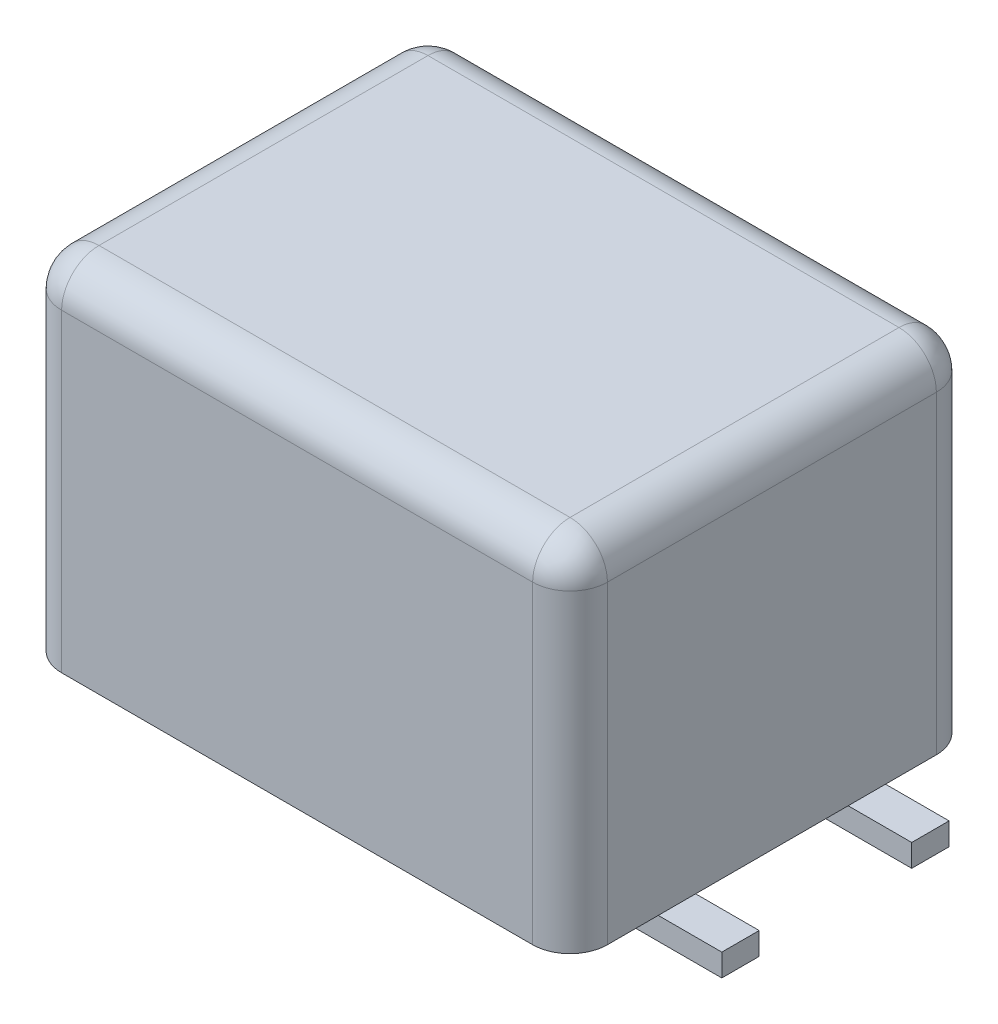
ISO-10303-21;
HEADER;
FILE_DESCRIPTION(('STEP AP214'),'2;1');
FILE_NAME('part.step','',(''),(''),'','','');
FILE_SCHEMA(('AUTOMOTIVE_DESIGN { 1 0 10303 214 1 1 1 1 }'));
ENDSEC;
DATA;
#1=APPLICATION_CONTEXT('core data for automotive mechanical design processes');
#2=APPLICATION_PROTOCOL_DEFINITION('international standard','automotive_design',2000,#1);
#3=PRODUCT_CONTEXT('',#1,'mechanical');
#4=PRODUCT('Part','Part','',(#3));
#5=PRODUCT_RELATED_PRODUCT_CATEGORY('part','',(#4));
#6=PRODUCT_DEFINITION_FORMATION('','',#4);
#7=PRODUCT_DEFINITION_CONTEXT('part definition',#1,'design');
#8=PRODUCT_DEFINITION('design','',#6,#7);
#9=PRODUCT_DEFINITION_SHAPE('','',#8);
#10=(LENGTH_UNIT() NAMED_UNIT(*) SI_UNIT(.MILLI.,.METRE.));
#11=(NAMED_UNIT(*) PLANE_ANGLE_UNIT() SI_UNIT($,.RADIAN.));
#12=(NAMED_UNIT(*) SI_UNIT($,.STERADIAN.) SOLID_ANGLE_UNIT());
#13=UNCERTAINTY_MEASURE_WITH_UNIT(LENGTH_MEASURE(1.E-05),#10,'distance_accuracy_value','');
#14=(GEOMETRIC_REPRESENTATION_CONTEXT(3) GLOBAL_UNCERTAINTY_ASSIGNED_CONTEXT((#13)) GLOBAL_UNIT_ASSIGNED_CONTEXT((#10,
#11,#12)) REPRESENTATION_CONTEXT('',''));
#15=CARTESIAN_POINT('',(0.,0.,0.));
#16=DIRECTION('',(0.,0.,1.));
#17=DIRECTION('',(1.,0.,0.));
#18=AXIS2_PLACEMENT_3D('',#15,#16,#17);
#19=CARTESIAN_POINT('',(3.15,0.3,2.2));
#20=DIRECTION('',(0.,1.,0.));
#21=DIRECTION('',(0.,0.,1.));
#22=AXIS2_PLACEMENT_3D('',#19,#20,#21);
#23=PLANE('',#22);
#24=DIRECTION('',(-1.,0.,0.));
#25=VECTOR('',#24,1.);
#26=CARTESIAN_POINT('',(-2.75,0.3,1.02));
#27=LINE('',#26,#25);
#28=CARTESIAN_POINT('',(-2.75,0.3,1.02));
#29=VERTEX_POINT('',#28);
#30=CARTESIAN_POINT('',(-3.65,0.3,1.02));
#31=VERTEX_POINT('',#30);
#32=EDGE_CURVE('E257',#29,#31,#27,.T.);
#33=ORIENTED_EDGE('',*,*,#32,.T.);
#34=DIRECTION('',(0.,0.,1.));
#35=VECTOR('',#34,1.);
#36=CARTESIAN_POINT('',(-3.65,0.3,-2.2));
#37=LINE('',#36,#35);
#38=CARTESIAN_POINT('',(-3.65,0.3,-1.02));
#39=VERTEX_POINT('',#38);
#40=EDGE_CURVE('E911',#39,#31,#37,.T.);
#41=ORIENTED_EDGE('',*,*,#40,.F.);
#42=DIRECTION('',(1.,0.,0.));
#43=VECTOR('',#42,1.);
#44=CARTESIAN_POINT('',(-2.75,0.3,-1.02));
#45=LINE('',#44,#43);
#46=CARTESIAN_POINT('',(-2.75,0.3,-1.02));
#47=VERTEX_POINT('',#46);
#48=EDGE_CURVE('E279',#39,#47,#45,.T.);
#49=ORIENTED_EDGE('',*,*,#48,.T.);
#50=DIRECTION('',(0.,0.,-1.));
#51=VECTOR('',#50,1.);
#52=CARTESIAN_POINT('',(-2.75,0.3,-1.52));
#53=LINE('',#52,#51);
#54=CARTESIAN_POINT('',(-2.75,0.3,-1.52));
#55=VERTEX_POINT('',#54);
#56=EDGE_CURVE('E299',#47,#55,#53,.T.);
#57=ORIENTED_EDGE('',*,*,#56,.T.);
#58=DIRECTION('',(-1.,0.,0.));
#59=VECTOR('',#58,1.);
#60=CARTESIAN_POINT('',(-2.75,0.3,-1.52));
#61=LINE('',#60,#59);
#62=CARTESIAN_POINT('',(-3.65,0.3,-1.52));
#63=VERTEX_POINT('',#62);
#64=EDGE_CURVE('E295',#55,#63,#61,.T.);
#65=ORIENTED_EDGE('',*,*,#64,.T.);
#66=CARTESIAN_POINT('',(-3.65,0.3,-2.2));
#67=VERTEX_POINT('',#66);
#68=EDGE_CURVE('E389',#67,#63,#37,.T.);
#69=ORIENTED_EDGE('',*,*,#68,.F.);
#70=CARTESIAN_POINT('',(-3.15,0.3,-2.2));
#71=DIRECTION('',(0.,1.,0.));
#72=DIRECTION('',(0.,0.,1.));
#73=AXIS2_PLACEMENT_3D('',#70,#71,#72);
#74=CIRCLE('',#73,0.5);
#75=CARTESIAN_POINT('',(-3.15,0.3,-2.7));
#76=VERTEX_POINT('',#75);
#77=EDGE_CURVE('E385',#76,#67,#74,.T.);
#78=ORIENTED_EDGE('',*,*,#77,.F.);
#79=DIRECTION('',(-1.,0.,0.));
#80=VECTOR('',#79,1.);
#81=CARTESIAN_POINT('',(-3.15,0.3,-2.7));
#82=LINE('',#81,#80);
#83=CARTESIAN_POINT('',(3.15,0.3,-2.7));
#84=VERTEX_POINT('',#83);
#85=EDGE_CURVE('E382',#84,#76,#82,.T.);
#86=ORIENTED_EDGE('',*,*,#85,.F.);
#87=CARTESIAN_POINT('',(3.15,0.3,-2.2));
#88=DIRECTION('',(0.,1.,0.));
#89=DIRECTION('',(0.,0.,-1.));
#90=AXIS2_PLACEMENT_3D('',#87,#88,#89);
#91=CIRCLE('',#90,0.5);
#92=CARTESIAN_POINT('',(3.65,0.3,-2.2));
#93=VERTEX_POINT('',#92);
#94=EDGE_CURVE('E378',#93,#84,#91,.T.);
#95=ORIENTED_EDGE('',*,*,#94,.F.);
#96=DIRECTION('',(0.,0.,-1.));
#97=VECTOR('',#96,1.);
#98=CARTESIAN_POINT('',(3.65,0.3,-2.2));
#99=LINE('',#98,#97);
#100=CARTESIAN_POINT('',(3.65,0.3,-1.52));
#101=VERTEX_POINT('',#100);
#102=EDGE_CURVE('E374',#101,#93,#99,.T.);
#103=ORIENTED_EDGE('',*,*,#102,.F.);
#104=DIRECTION('',(1.,0.,0.));
#105=VECTOR('',#104,1.);
#106=CARTESIAN_POINT('',(3.15,0.3,-1.52));
#107=LINE('',#106,#105);
#108=CARTESIAN_POINT('',(2.75,0.3,-1.52));
#109=VERTEX_POINT('',#108);
#110=EDGE_CURVE('E415',#109,#101,#107,.T.);
#111=ORIENTED_EDGE('',*,*,#110,.F.);
#112=DIRECTION('',(0.,0.,1.));
#113=VECTOR('',#112,1.);
#114=CARTESIAN_POINT('',(2.75,0.3,-1.52));
#115=LINE('',#114,#113);
#116=CARTESIAN_POINT('',(2.75,0.3,-1.02));
#117=VERTEX_POINT('',#116);
#118=EDGE_CURVE('E323',#109,#117,#115,.T.);
#119=ORIENTED_EDGE('',*,*,#118,.T.);
#120=DIRECTION('',(1.,0.,0.));
#121=VECTOR('',#120,1.);
#122=CARTESIAN_POINT('',(2.75,0.3,-1.02));
#123=LINE('',#122,#121);
#124=CARTESIAN_POINT('',(3.65,0.3,-1.02));
#125=VERTEX_POINT('',#124);
#126=EDGE_CURVE('E332',#117,#125,#123,.T.);
#127=ORIENTED_EDGE('',*,*,#126,.T.);
#128=CARTESIAN_POINT('',(3.65,0.3,1.02));
#129=VERTEX_POINT('',#128);
#130=EDGE_CURVE('E920',#129,#125,#99,.T.);
#131=ORIENTED_EDGE('',*,*,#130,.F.);
#132=DIRECTION('',(-1.,0.,0.));
#133=VECTOR('',#132,1.);
#134=CARTESIAN_POINT('',(2.75,0.3,1.02));
#135=LINE('',#134,#133);
#136=CARTESIAN_POINT('',(2.75,0.3,1.02));
#137=VERTEX_POINT('',#136);
#138=EDGE_CURVE('E362',#129,#137,#135,.T.);
#139=ORIENTED_EDGE('',*,*,#138,.T.);
#140=DIRECTION('',(0.,0.,1.));
#141=VECTOR('',#140,1.);
#142=CARTESIAN_POINT('',(2.75,0.3,1.02));
#143=LINE('',#142,#141);
#144=CARTESIAN_POINT('',(2.75,0.3,1.52));
#145=VERTEX_POINT('',#144);
#146=EDGE_CURVE('E354',#137,#145,#143,.T.);
#147=ORIENTED_EDGE('',*,*,#146,.T.);
#148=DIRECTION('',(1.,0.,0.));
#149=VECTOR('',#148,1.);
#150=CARTESIAN_POINT('',(2.75,0.3,1.52));
#151=LINE('',#150,#149);
#152=CARTESIAN_POINT('',(3.65,0.3,1.52));
#153=VERTEX_POINT('',#152);
#154=EDGE_CURVE('E365',#145,#153,#151,.T.);
#155=ORIENTED_EDGE('',*,*,#154,.T.);
#156=CARTESIAN_POINT('',(3.65,0.3,2.2));
#157=VERTEX_POINT('',#156);
#158=EDGE_CURVE('E375',#157,#153,#99,.T.);
#159=ORIENTED_EDGE('',*,*,#158,.F.);
#160=CARTESIAN_POINT('',(3.15,0.3,2.2));
#161=DIRECTION('',(0.,1.,0.));
#162=DIRECTION('',(0.,0.,1.));
#163=AXIS2_PLACEMENT_3D('',#160,#161,#162);
#164=CIRCLE('',#163,0.5);
#165=CARTESIAN_POINT('',(3.15,0.3,2.7));
#166=VERTEX_POINT('',#165);
#167=EDGE_CURVE('E357',#166,#157,#164,.T.);
#168=ORIENTED_EDGE('',*,*,#167,.F.);
#169=DIRECTION('',(1.,0.,0.));
#170=VECTOR('',#169,1.);
#171=CARTESIAN_POINT('',(-3.14999999999999,0.3,2.7));
#172=LINE('',#171,#170);
#173=CARTESIAN_POINT('',(-3.14999999999999,0.3,2.7));
#174=VERTEX_POINT('',#173);
#175=EDGE_CURVE('E396',#174,#166,#172,.T.);
#176=ORIENTED_EDGE('',*,*,#175,.F.);
#177=CARTESIAN_POINT('',(-3.15,0.3,2.2));
#178=DIRECTION('',(0.,1.,0.));
#179=DIRECTION('',(0.,0.,1.));
#180=AXIS2_PLACEMENT_3D('',#177,#178,#179);
#181=CIRCLE('',#180,0.5);
#182=CARTESIAN_POINT('',(-3.65,0.3,2.2));
#183=VERTEX_POINT('',#182);
#184=EDGE_CURVE('E392',#183,#174,#181,.T.);
#185=ORIENTED_EDGE('',*,*,#184,.F.);
#186=CARTESIAN_POINT('',(-3.65,0.3,1.52));
#187=VERTEX_POINT('',#186);
#188=EDGE_CURVE('E388',#187,#183,#37,.T.);
#189=ORIENTED_EDGE('',*,*,#188,.F.);
#190=DIRECTION('',(1.,0.,0.));
#191=VECTOR('',#190,1.);
#192=CARTESIAN_POINT('',(-2.75,0.3,1.52));
#193=LINE('',#192,#191);
#194=CARTESIAN_POINT('',(-2.75,0.3,1.52));
#195=VERTEX_POINT('',#194);
#196=EDGE_CURVE('E248',#187,#195,#193,.T.);
#197=ORIENTED_EDGE('',*,*,#196,.T.);
#198=DIRECTION('',(0.,0.,-1.));
#199=VECTOR('',#198,1.);
#200=CARTESIAN_POINT('',(-2.75,0.3,1.02));
#201=LINE('',#200,#199);
#202=EDGE_CURVE('E251',#195,#29,#201,.T.);
#203=ORIENTED_EDGE('',*,*,#202,.T.);
#204=EDGE_LOOP('',(#33,#41,#49,#57,#65,#69,#78,#86,#95,#103,#111,#119,#127,#131,#139,#147,#155,
#159,#168,#176,#185,#189,#197,#203));
#205=FACE_BOUND('',#204,.T.);
#206=ADVANCED_FACE('F33',(#205),#23,.F.);
#207=CARTESIAN_POINT('',(3.15,5.,2.2));
#208=DIRECTION('',(0.,-1.,0.));
#209=DIRECTION('',(0.,0.,-1.));
#210=AXIS2_PLACEMENT_3D('',#207,#208,#209);
#211=CYLINDRICAL_SURFACE('',#210,0.5);
#212=DIRECTION('',(0.,-1.,0.));
#213=VECTOR('',#212,1.);
#214=CARTESIAN_POINT('',(3.65,5.,2.2));
#215=LINE('',#214,#213);
#216=CARTESIAN_POINT('',(3.65,4.5,2.2));
#217=VERTEX_POINT('',#216);
#218=EDGE_CURVE('E413',#217,#157,#215,.T.);
#219=ORIENTED_EDGE('',*,*,#218,.F.);
#220=CARTESIAN_POINT('',(3.15,4.5,2.2));
#221=DIRECTION('',(0.,-1.,0.));
#222=DIRECTION('',(0.,0.,-1.));
#223=AXIS2_PLACEMENT_3D('',#220,#221,#222);
#224=CIRCLE('',#223,0.5);
#225=CARTESIAN_POINT('',(3.15,4.5,2.7));
#226=VERTEX_POINT('',#225);
#227=EDGE_CURVE('E42',#217,#226,#224,.T.);
#228=ORIENTED_EDGE('',*,*,#227,.T.);
#229=DIRECTION('',(0.,-1.,0.));
#230=VECTOR('',#229,1.);
#231=CARTESIAN_POINT('',(3.15,5.,2.7));
#232=LINE('',#231,#230);
#233=EDGE_CURVE('E399',#226,#166,#232,.T.);
#234=ORIENTED_EDGE('',*,*,#233,.T.);
#235=ORIENTED_EDGE('',*,*,#167,.T.);
#236=EDGE_LOOP('',(#219,#228,#234,#235));
#237=FACE_BOUND('',#236,.T.);
#238=ADVANCED_FACE('F529',(#237),#211,.T.);
#239=CARTESIAN_POINT('',(3.65,5.,-2.2));
#240=DIRECTION('',(-1.,0.,0.));
#241=DIRECTION('',(0.,0.,1.));
#242=AXIS2_PLACEMENT_3D('',#239,#240,#241);
#243=PLANE('',#242);
#244=DIRECTION('',(0.,-1.,0.));
#245=VECTOR('',#244,1.);
#246=CARTESIAN_POINT('',(3.65,5.,-2.2));
#247=LINE('',#246,#245);
#248=CARTESIAN_POINT('',(3.65,4.5,-2.2));
#249=VERTEX_POINT('',#248);
#250=EDGE_CURVE('E411',#249,#93,#247,.T.);
#251=ORIENTED_EDGE('',*,*,#250,.F.);
#252=DIRECTION('',(0.,0.,-1.));
#253=VECTOR('',#252,1.);
#254=CARTESIAN_POINT('',(3.65,4.5,2.2));
#255=LINE('',#254,#253);
#256=EDGE_CURVE('E57',#249,#217,#255,.F.);
#257=ORIENTED_EDGE('',*,*,#256,.T.);
#258=ORIENTED_EDGE('',*,*,#218,.T.);
#259=ORIENTED_EDGE('',*,*,#158,.T.);
#260=EDGE_CURVE('E379',#153,#129,#99,.T.);
#261=ORIENTED_EDGE('',*,*,#260,.T.);
#262=ORIENTED_EDGE('',*,*,#130,.T.);
#263=EDGE_CURVE('E478',#125,#101,#99,.T.);
#264=ORIENTED_EDGE('',*,*,#263,.T.);
#265=ORIENTED_EDGE('',*,*,#102,.T.);
#266=EDGE_LOOP('',(#251,#257,#258,#259,#261,#262,#264,#265));
#267=FACE_BOUND('',#266,.T.);
#268=ADVANCED_FACE('F473',(#267),#243,.F.);
#269=CARTESIAN_POINT('',(3.15,5.,-2.2));
#270=DIRECTION('',(0.,-1.,0.));
#271=DIRECTION('',(0.,0.,-1.));
#272=AXIS2_PLACEMENT_3D('',#269,#270,#271);
#273=CYLINDRICAL_SURFACE('',#272,0.5);
#274=DIRECTION('',(0.,-1.,0.));
#275=VECTOR('',#274,1.);
#276=CARTESIAN_POINT('',(3.15,5.,-2.7));
#277=LINE('',#276,#275);
#278=CARTESIAN_POINT('',(3.15,4.5,-2.7));
#279=VERTEX_POINT('',#278);
#280=EDGE_CURVE('E409',#279,#84,#277,.T.);
#281=ORIENTED_EDGE('',*,*,#280,.F.);
#282=CARTESIAN_POINT('',(3.15,4.5,-2.2));
#283=DIRECTION('',(0.,-1.,0.));
#284=DIRECTION('',(0.,0.,-1.));
#285=AXIS2_PLACEMENT_3D('',#282,#283,#284);
#286=CIRCLE('',#285,0.5);
#287=EDGE_CURVE('E436',#279,#249,#286,.T.);
#288=ORIENTED_EDGE('',*,*,#287,.T.);
#289=ORIENTED_EDGE('',*,*,#250,.T.);
#290=ORIENTED_EDGE('',*,*,#94,.T.);
#291=EDGE_LOOP('',(#281,#288,#289,#290));
#292=FACE_BOUND('',#291,.T.);
#293=ADVANCED_FACE('F471',(#292),#273,.T.);
#294=CARTESIAN_POINT('',(-3.15,5.,-2.7));
#295=DIRECTION('',(0.,0.,1.));
#296=DIRECTION('',(1.,0.,0.));
#297=AXIS2_PLACEMENT_3D('',#294,#295,#296);
#298=PLANE('',#297);
#299=DIRECTION('',(0.,-1.,0.));
#300=VECTOR('',#299,1.);
#301=CARTESIAN_POINT('',(-3.15,5.,-2.7));
#302=LINE('',#301,#300);
#303=CARTESIAN_POINT('',(-3.15,4.5,-2.7));
#304=VERTEX_POINT('',#303);
#305=EDGE_CURVE('E407',#304,#76,#302,.T.);
#306=ORIENTED_EDGE('',*,*,#305,.F.);
#307=DIRECTION('',(-1.,0.,0.));
#308=VECTOR('',#307,1.);
#309=CARTESIAN_POINT('',(3.15,4.5,-2.7));
#310=LINE('',#309,#308);
#311=EDGE_CURVE('E434',#304,#279,#310,.F.);
#312=ORIENTED_EDGE('',*,*,#311,.T.);
#313=ORIENTED_EDGE('',*,*,#280,.T.);
#314=ORIENTED_EDGE('',*,*,#85,.T.);
#315=EDGE_LOOP('',(#306,#312,#313,#314));
#316=FACE_BOUND('',#315,.T.);
#317=ADVANCED_FACE('F485',(#316),#298,.F.);
#318=CARTESIAN_POINT('',(-3.15,5.,-2.2));
#319=DIRECTION('',(0.,-1.,0.));
#320=DIRECTION('',(0.,0.,-1.));
#321=AXIS2_PLACEMENT_3D('',#318,#319,#320);
#322=CYLINDRICAL_SURFACE('',#321,0.5);
#323=DIRECTION('',(0.,-1.,0.));
#324=VECTOR('',#323,1.);
#325=CARTESIAN_POINT('',(-3.65,5.,-2.2));
#326=LINE('',#325,#324);
#327=CARTESIAN_POINT('',(-3.65,4.5,-2.2));
#328=VERTEX_POINT('',#327);
#329=EDGE_CURVE('E405',#328,#67,#326,.T.);
#330=ORIENTED_EDGE('',*,*,#329,.F.);
#331=CARTESIAN_POINT('',(-3.15,4.5,-2.2));
#332=DIRECTION('',(0.,-1.,0.));
#333=DIRECTION('',(0.,0.,-1.));
#334=AXIS2_PLACEMENT_3D('',#331,#332,#333);
#335=CIRCLE('',#334,0.5);
#336=EDGE_CURVE('E432',#328,#304,#335,.T.);
#337=ORIENTED_EDGE('',*,*,#336,.T.);
#338=ORIENTED_EDGE('',*,*,#305,.T.);
#339=ORIENTED_EDGE('',*,*,#77,.T.);
#340=EDGE_LOOP('',(#330,#337,#338,#339));
#341=FACE_BOUND('',#340,.T.);
#342=ADVANCED_FACE('F488',(#341),#322,.T.);
#343=CARTESIAN_POINT('',(-3.65,5.,-2.2));
#344=DIRECTION('',(1.,0.,0.));
#345=DIRECTION('',(0.,0.,-1.));
#346=AXIS2_PLACEMENT_3D('',#343,#344,#345);
#347=PLANE('',#346);
#348=DIRECTION('',(0.,-1.,0.));
#349=VECTOR('',#348,1.);
#350=CARTESIAN_POINT('',(-3.65,5.,2.2));
#351=LINE('',#350,#349);
#352=CARTESIAN_POINT('',(-3.65,4.5,2.2));
#353=VERTEX_POINT('',#352);
#354=EDGE_CURVE('E403',#353,#183,#351,.T.);
#355=ORIENTED_EDGE('',*,*,#354,.F.);
#356=DIRECTION('',(0.,0.,1.));
#357=VECTOR('',#356,1.);
#358=CARTESIAN_POINT('',(-3.65,4.5,-2.2));
#359=LINE('',#358,#357);
#360=EDGE_CURVE('E430',#353,#328,#359,.F.);
#361=ORIENTED_EDGE('',*,*,#360,.T.);
#362=ORIENTED_EDGE('',*,*,#329,.T.);
#363=ORIENTED_EDGE('',*,*,#68,.T.);
#364=EDGE_CURVE('E393',#63,#39,#37,.T.);
#365=ORIENTED_EDGE('',*,*,#364,.T.);
#366=ORIENTED_EDGE('',*,*,#40,.T.);
#367=EDGE_CURVE('E915',#31,#187,#37,.T.);
#368=ORIENTED_EDGE('',*,*,#367,.T.);
#369=ORIENTED_EDGE('',*,*,#188,.T.);
#370=EDGE_LOOP('',(#355,#361,#362,#363,#365,#366,#368,#369));
#371=FACE_BOUND('',#370,.T.);
#372=ADVANCED_FACE('F541',(#371),#347,.F.);
#373=CARTESIAN_POINT('',(-3.15,5.,2.2));
#374=DIRECTION('',(0.,-1.,0.));
#375=DIRECTION('',(0.,0.,-1.));
#376=AXIS2_PLACEMENT_3D('',#373,#374,#375);
#377=CYLINDRICAL_SURFACE('',#376,0.5);
#378=DIRECTION('',(0.,-1.,0.));
#379=VECTOR('',#378,1.);
#380=CARTESIAN_POINT('',(-3.14999999999999,5.,2.7));
#381=LINE('',#380,#379);
#382=CARTESIAN_POINT('',(-3.14999999999999,4.5,2.7));
#383=VERTEX_POINT('',#382);
#384=EDGE_CURVE('E401',#383,#174,#381,.T.);
#385=ORIENTED_EDGE('',*,*,#384,.F.);
#386=CARTESIAN_POINT('',(-3.15,4.5,2.2));
#387=DIRECTION('',(0.,-1.,0.));
#388=DIRECTION('',(0.,0.,-1.));
#389=AXIS2_PLACEMENT_3D('',#386,#387,#388);
#390=CIRCLE('',#389,0.5);
#391=EDGE_CURVE('E418',#383,#353,#390,.T.);
#392=ORIENTED_EDGE('',*,*,#391,.T.);
#393=ORIENTED_EDGE('',*,*,#354,.T.);
#394=ORIENTED_EDGE('',*,*,#184,.T.);
#395=EDGE_LOOP('',(#385,#392,#393,#394));
#396=FACE_BOUND('',#395,.T.);
#397=ADVANCED_FACE('F515',(#396),#377,.T.);
#398=CARTESIAN_POINT('',(-3.14999999999999,5.,2.7));
#399=DIRECTION('',(0.,0.,-1.));
#400=DIRECTION('',(-1.,0.,0.));
#401=AXIS2_PLACEMENT_3D('',#398,#399,#400);
#402=PLANE('',#401);
#403=ORIENTED_EDGE('',*,*,#233,.F.);
#404=DIRECTION('',(1.,0.,0.));
#405=VECTOR('',#404,1.);
#406=CARTESIAN_POINT('',(-3.14999999999999,4.5,2.7));
#407=LINE('',#406,#405);
#408=EDGE_CURVE('E11',#226,#383,#407,.F.);
#409=ORIENTED_EDGE('',*,*,#408,.T.);
#410=ORIENTED_EDGE('',*,*,#384,.T.);
#411=ORIENTED_EDGE('',*,*,#175,.T.);
#412=EDGE_LOOP('',(#403,#409,#410,#411));
#413=FACE_BOUND('',#412,.T.);
#414=ADVANCED_FACE('F512',(#413),#402,.F.);
#415=CARTESIAN_POINT('',(3.15,5.,2.2));
#416=DIRECTION('',(0.,1.,0.));
#417=DIRECTION('',(0.,0.,1.));
#418=AXIS2_PLACEMENT_3D('',#415,#416,#417);
#419=PLANE('',#418);
#420=DIRECTION('',(-1.,0.,0.));
#421=VECTOR('',#420,1.);
#422=CARTESIAN_POINT('',(-3.15,5.,-2.2));
#423=LINE('',#422,#421);
#424=CARTESIAN_POINT('',(3.15,5.,-2.2));
#425=VERTEX_POINT('',#424);
#426=CARTESIAN_POINT('',(-3.15,5.,-2.2));
#427=VERTEX_POINT('',#426);
#428=EDGE_CURVE('E425',#425,#427,#423,.T.);
#429=ORIENTED_EDGE('',*,*,#428,.T.);
#430=DIRECTION('',(0.,0.,1.));
#431=VECTOR('',#430,1.);
#432=CARTESIAN_POINT('',(-3.15,5.,2.2));
#433=LINE('',#432,#431);
#434=CARTESIAN_POINT('',(-3.15,5.,2.2));
#435=VERTEX_POINT('',#434);
#436=EDGE_CURVE('E427',#427,#435,#433,.T.);
#437=ORIENTED_EDGE('',*,*,#436,.T.);
#438=DIRECTION('',(1.,0.,0.));
#439=VECTOR('',#438,1.);
#440=CARTESIAN_POINT('',(3.15,5.,2.2));
#441=LINE('',#440,#439);
#442=CARTESIAN_POINT('',(3.15,5.,2.2));
#443=VERTEX_POINT('',#442);
#444=EDGE_CURVE('E421',#435,#443,#441,.T.);
#445=ORIENTED_EDGE('',*,*,#444,.T.);
#446=DIRECTION('',(0.,0.,-1.));
#447=VECTOR('',#446,1.);
#448=CARTESIAN_POINT('',(3.15,5.,-2.2));
#449=LINE('',#448,#447);
#450=EDGE_CURVE('E423',#443,#425,#449,.T.);
#451=ORIENTED_EDGE('',*,*,#450,.T.);
#452=EDGE_LOOP('',(#429,#437,#445,#451));
#453=FACE_BOUND('',#452,.T.);
#454=ADVANCED_FACE('F500',(#453),#419,.T.);
#455=CARTESIAN_POINT('',(3.15,0.3,2.2));
#456=DIRECTION('',(0.,1.,0.));
#457=DIRECTION('',(0.,0.,1.));
#458=AXIS2_PLACEMENT_3D('',#455,#456,#457);
#459=PLANE('',#458);
#460=ORIENTED_EDGE('',*,*,#260,.F.);
#461=CARTESIAN_POINT('',(4.5,0.3,1.52));
#462=VERTEX_POINT('',#461);
#463=EDGE_CURVE('E341',#153,#462,#151,.T.);
#464=ORIENTED_EDGE('',*,*,#463,.T.);
#465=DIRECTION('',(0.,0.,-1.));
#466=VECTOR('',#465,1.);
#467=CARTESIAN_POINT('',(4.5,0.3,1.02));
#468=LINE('',#467,#466);
#469=CARTESIAN_POINT('',(4.5,0.3,1.02));
#470=VERTEX_POINT('',#469);
#471=EDGE_CURVE('E361',#462,#470,#468,.T.);
#472=ORIENTED_EDGE('',*,*,#471,.T.);
#473=EDGE_CURVE('E358',#470,#129,#135,.T.);
#474=ORIENTED_EDGE('',*,*,#473,.T.);
#475=EDGE_LOOP('',(#460,#464,#472,#474));
#476=FACE_BOUND('',#475,.T.);
#477=ADVANCED_FACE('F586',(#476),#459,.T.);
#478=CARTESIAN_POINT('',(4.5,2.12002747232013,1.02));
#479=DIRECTION('',(-1.,0.,0.));
#480=DIRECTION('',(0.,0.,1.));
#481=AXIS2_PLACEMENT_3D('',#478,#479,#480);
#482=PLANE('',#481);
#483=ORIENTED_EDGE('',*,*,#471,.F.);
#484=DIRECTION('',(0.,-1.,0.));
#485=VECTOR('',#484,1.);
#486=CARTESIAN_POINT('',(4.5,2.12002747232013,1.52));
#487=LINE('',#486,#485);
#488=CARTESIAN_POINT('',(4.5,0.,1.52));
#489=VERTEX_POINT('',#488);
#490=EDGE_CURVE('E325',#462,#489,#487,.T.);
#491=ORIENTED_EDGE('',*,*,#490,.T.);
#492=DIRECTION('',(0.,0.,-1.));
#493=VECTOR('',#492,1.);
#494=CARTESIAN_POINT('',(4.5,0.,1.02));
#495=LINE('',#494,#493);
#496=CARTESIAN_POINT('',(4.5,0.,1.02));
#497=VERTEX_POINT('',#496);
#498=EDGE_CURVE('E351',#489,#497,#495,.T.);
#499=ORIENTED_EDGE('',*,*,#498,.T.);
#500=DIRECTION('',(0.,-1.,0.));
#501=VECTOR('',#500,1.);
#502=CARTESIAN_POINT('',(4.5,2.12002747232013,1.02));
#503=LINE('',#502,#501);
#504=EDGE_CURVE('E350',#470,#497,#503,.T.);
#505=ORIENTED_EDGE('',*,*,#504,.F.);
#506=EDGE_LOOP('',(#483,#491,#499,#505));
#507=FACE_BOUND('',#506,.T.);
#508=ADVANCED_FACE('F593',(#507),#482,.F.);
#509=CARTESIAN_POINT('',(2.75,2.12002747232013,1.02));
#510=DIRECTION('',(0.,0.,1.));
#511=DIRECTION('',(1.,0.,0.));
#512=AXIS2_PLACEMENT_3D('',#509,#510,#511);
#513=PLANE('',#512);
#514=ORIENTED_EDGE('',*,*,#473,.F.);
#515=ORIENTED_EDGE('',*,*,#504,.T.);
#516=DIRECTION('',(-1.,0.,0.));
#517=VECTOR('',#516,1.);
#518=CARTESIAN_POINT('',(2.75,0.,1.02));
#519=LINE('',#518,#517);
#520=CARTESIAN_POINT('',(2.75,0.,1.02));
#521=VERTEX_POINT('',#520);
#522=EDGE_CURVE('E347',#497,#521,#519,.T.);
#523=ORIENTED_EDGE('',*,*,#522,.T.);
#524=DIRECTION('',(0.,-1.,0.));
#525=VECTOR('',#524,1.);
#526=CARTESIAN_POINT('',(2.75,2.12002747232013,1.02));
#527=LINE('',#526,#525);
#528=EDGE_CURVE('E346',#137,#521,#527,.T.);
#529=ORIENTED_EDGE('',*,*,#528,.F.);
#530=ORIENTED_EDGE('',*,*,#138,.F.);
#531=EDGE_LOOP('',(#514,#515,#523,#529,#530));
#532=FACE_BOUND('',#531,.T.);
#533=ADVANCED_FACE('F600',(#532),#513,.F.);
#534=CARTESIAN_POINT('',(2.75,2.12002747232013,1.02));
#535=DIRECTION('',(1.,0.,0.));
#536=DIRECTION('',(0.,0.,-1.));
#537=AXIS2_PLACEMENT_3D('',#534,#535,#536);
#538=PLANE('',#537);
#539=ORIENTED_EDGE('',*,*,#146,.F.);
#540=ORIENTED_EDGE('',*,*,#528,.T.);
#541=DIRECTION('',(0.,0.,1.));
#542=VECTOR('',#541,1.);
#543=CARTESIAN_POINT('',(2.75,0.,1.02));
#544=LINE('',#543,#542);
#545=CARTESIAN_POINT('',(2.75,0.,1.52));
#546=VERTEX_POINT('',#545);
#547=EDGE_CURVE('E343',#521,#546,#544,.T.);
#548=ORIENTED_EDGE('',*,*,#547,.T.);
#549=DIRECTION('',(0.,-1.,0.));
#550=VECTOR('',#549,1.);
#551=CARTESIAN_POINT('',(2.75,2.12002747232013,1.52));
#552=LINE('',#551,#550);
#553=EDGE_CURVE('E342',#145,#546,#552,.T.);
#554=ORIENTED_EDGE('',*,*,#553,.F.);
#555=EDGE_LOOP('',(#539,#540,#548,#554));
#556=FACE_BOUND('',#555,.T.);
#557=ADVANCED_FACE('F608',(#556),#538,.F.);
#558=CARTESIAN_POINT('',(2.75,2.12002747232013,1.52));
#559=DIRECTION('',(0.,0.,-1.));
#560=DIRECTION('',(-1.,0.,0.));
#561=AXIS2_PLACEMENT_3D('',#558,#559,#560);
#562=PLANE('',#561);
#563=ORIENTED_EDGE('',*,*,#154,.F.);
#564=ORIENTED_EDGE('',*,*,#553,.T.);
#565=DIRECTION('',(1.,0.,0.));
#566=VECTOR('',#565,1.);
#567=CARTESIAN_POINT('',(2.75,0.,1.52));
#568=LINE('',#567,#566);
#569=EDGE_CURVE('E338',#546,#489,#568,.T.);
#570=ORIENTED_EDGE('',*,*,#569,.T.);
#571=ORIENTED_EDGE('',*,*,#490,.F.);
#572=ORIENTED_EDGE('',*,*,#463,.F.);
#573=EDGE_LOOP('',(#563,#564,#570,#571,#572));
#574=FACE_BOUND('',#573,.T.);
#575=ADVANCED_FACE('F616',(#574),#562,.F.);
#576=CARTESIAN_POINT('',(0.,0.,0.));
#577=DIRECTION('',(0.,1.,0.));
#578=DIRECTION('',(0.,0.,1.));
#579=AXIS2_PLACEMENT_3D('',#576,#577,#578);
#580=PLANE('',#579);
#581=ORIENTED_EDGE('',*,*,#498,.F.);
#582=ORIENTED_EDGE('',*,*,#569,.F.);
#583=ORIENTED_EDGE('',*,*,#547,.F.);
#584=ORIENTED_EDGE('',*,*,#522,.F.);
#585=EDGE_LOOP('',(#581,#582,#583,#584));
#586=FACE_BOUND('',#585,.T.);
#587=ADVANCED_FACE('F624',(#586),#580,.F.);
#588=CARTESIAN_POINT('',(3.15,0.3,2.2));
#589=DIRECTION('',(0.,1.,0.));
#590=DIRECTION('',(0.,0.,1.));
#591=AXIS2_PLACEMENT_3D('',#588,#589,#590);
#592=PLANE('',#591);
#593=ORIENTED_EDGE('',*,*,#263,.F.);
#594=CARTESIAN_POINT('',(4.5,0.3,-1.02));
#595=VERTEX_POINT('',#594);
#596=EDGE_CURVE('E310',#125,#595,#123,.T.);
#597=ORIENTED_EDGE('',*,*,#596,.T.);
#598=DIRECTION('',(0.,0.,-1.));
#599=VECTOR('',#598,1.);
#600=CARTESIAN_POINT('',(4.5,0.3,-1.52));
#601=LINE('',#600,#599);
#602=CARTESIAN_POINT('',(4.5,0.3,-1.52));
#603=VERTEX_POINT('',#602);
#604=EDGE_CURVE('E329',#595,#603,#601,.T.);
#605=ORIENTED_EDGE('',*,*,#604,.T.);
#606=DIRECTION('',(-1.,0.,0.));
#607=VECTOR('',#606,1.);
#608=CARTESIAN_POINT('',(2.75,0.3,-1.52));
#609=LINE('',#608,#607);
#610=EDGE_CURVE('E326',#603,#101,#609,.T.);
#611=ORIENTED_EDGE('',*,*,#610,.T.);
#612=EDGE_LOOP('',(#593,#597,#605,#611));
#613=FACE_BOUND('',#612,.T.);
#614=ADVANCED_FACE('F632',(#613),#592,.T.);
#615=CARTESIAN_POINT('',(4.5,2.12002747232013,-1.52));
#616=DIRECTION('',(-1.,0.,0.));
#617=DIRECTION('',(0.,0.,1.));
#618=AXIS2_PLACEMENT_3D('',#615,#616,#617);
#619=PLANE('',#618);
#620=ORIENTED_EDGE('',*,*,#604,.F.);
#621=DIRECTION('',(0.,-1.,0.));
#622=VECTOR('',#621,1.);
#623=CARTESIAN_POINT('',(4.5,2.12002747232013,-1.02));
#624=LINE('',#623,#622);
#625=CARTESIAN_POINT('',(4.5,0.,-1.02));
#626=VERTEX_POINT('',#625);
#627=EDGE_CURVE('E294',#595,#626,#624,.T.);
#628=ORIENTED_EDGE('',*,*,#627,.T.);
#629=DIRECTION('',(0.,0.,-1.));
#630=VECTOR('',#629,1.);
#631=CARTESIAN_POINT('',(4.5,0.,-1.52));
#632=LINE('',#631,#630);
#633=CARTESIAN_POINT('',(4.5,0.,-1.52));
#634=VERTEX_POINT('',#633);
#635=EDGE_CURVE('E320',#626,#634,#632,.T.);
#636=ORIENTED_EDGE('',*,*,#635,.T.);
#637=DIRECTION('',(0.,-1.,0.));
#638=VECTOR('',#637,1.);
#639=CARTESIAN_POINT('',(4.5,2.12002747232013,-1.52));
#640=LINE('',#639,#638);
#641=EDGE_CURVE('E319',#603,#634,#640,.T.);
#642=ORIENTED_EDGE('',*,*,#641,.F.);
#643=EDGE_LOOP('',(#620,#628,#636,#642));
#644=FACE_BOUND('',#643,.T.);
#645=ADVANCED_FACE('F640',(#644),#619,.F.);
#646=CARTESIAN_POINT('',(2.75,2.12002747232013,-1.52));
#647=DIRECTION('',(0.,0.,1.));
#648=DIRECTION('',(1.,0.,0.));
#649=AXIS2_PLACEMENT_3D('',#646,#647,#648);
#650=PLANE('',#649);
#651=ORIENTED_EDGE('',*,*,#610,.F.);
#652=ORIENTED_EDGE('',*,*,#641,.T.);
#653=DIRECTION('',(-1.,0.,0.));
#654=VECTOR('',#653,1.);
#655=CARTESIAN_POINT('',(2.75,0.,-1.52));
#656=LINE('',#655,#654);
#657=CARTESIAN_POINT('',(2.75,0.,-1.52));
#658=VERTEX_POINT('',#657);
#659=EDGE_CURVE('E316',#634,#658,#656,.T.);
#660=ORIENTED_EDGE('',*,*,#659,.T.);
#661=DIRECTION('',(0.,-1.,0.));
#662=VECTOR('',#661,1.);
#663=CARTESIAN_POINT('',(2.75,2.12002747232013,-1.52));
#664=LINE('',#663,#662);
#665=EDGE_CURVE('E315',#109,#658,#664,.T.);
#666=ORIENTED_EDGE('',*,*,#665,.F.);
#667=ORIENTED_EDGE('',*,*,#110,.T.);
#668=EDGE_LOOP('',(#651,#652,#660,#666,#667));
#669=FACE_BOUND('',#668,.T.);
#670=ADVANCED_FACE('F648',(#669),#650,.F.);
#671=CARTESIAN_POINT('',(2.75,2.12002747232013,-1.52));
#672=DIRECTION('',(1.,0.,0.));
#673=DIRECTION('',(0.,0.,-1.));
#674=AXIS2_PLACEMENT_3D('',#671,#672,#673);
#675=PLANE('',#674);
#676=ORIENTED_EDGE('',*,*,#118,.F.);
#677=ORIENTED_EDGE('',*,*,#665,.T.);
#678=DIRECTION('',(0.,0.,1.));
#679=VECTOR('',#678,1.);
#680=CARTESIAN_POINT('',(2.75,0.,-1.52));
#681=LINE('',#680,#679);
#682=CARTESIAN_POINT('',(2.75,0.,-1.02));
#683=VERTEX_POINT('',#682);
#684=EDGE_CURVE('E312',#658,#683,#681,.T.);
#685=ORIENTED_EDGE('',*,*,#684,.T.);
#686=DIRECTION('',(0.,-1.,0.));
#687=VECTOR('',#686,1.);
#688=CARTESIAN_POINT('',(2.75,2.12002747232013,-1.02));
#689=LINE('',#688,#687);
#690=EDGE_CURVE('E311',#117,#683,#689,.T.);
#691=ORIENTED_EDGE('',*,*,#690,.F.);
#692=EDGE_LOOP('',(#676,#677,#685,#691));
#693=FACE_BOUND('',#692,.T.);
#694=ADVANCED_FACE('F656',(#693),#675,.F.);
#695=CARTESIAN_POINT('',(2.75,2.12002747232013,-1.02));
#696=DIRECTION('',(0.,0.,-1.));
#697=DIRECTION('',(-1.,0.,0.));
#698=AXIS2_PLACEMENT_3D('',#695,#696,#697);
#699=PLANE('',#698);
#700=ORIENTED_EDGE('',*,*,#126,.F.);
#701=ORIENTED_EDGE('',*,*,#690,.T.);
#702=DIRECTION('',(1.,0.,0.));
#703=VECTOR('',#702,1.);
#704=CARTESIAN_POINT('',(2.75,0.,-1.02));
#705=LINE('',#704,#703);
#706=EDGE_CURVE('E307',#683,#626,#705,.T.);
#707=ORIENTED_EDGE('',*,*,#706,.T.);
#708=ORIENTED_EDGE('',*,*,#627,.F.);
#709=ORIENTED_EDGE('',*,*,#596,.F.);
#710=EDGE_LOOP('',(#700,#701,#707,#708,#709));
#711=FACE_BOUND('',#710,.T.);
#712=ADVANCED_FACE('F664',(#711),#699,.F.);
#713=CARTESIAN_POINT('',(0.,0.,0.));
#714=DIRECTION('',(0.,1.,0.));
#715=DIRECTION('',(0.,0.,1.));
#716=AXIS2_PLACEMENT_3D('',#713,#714,#715);
#717=PLANE('',#716);
#718=ORIENTED_EDGE('',*,*,#635,.F.);
#719=ORIENTED_EDGE('',*,*,#706,.F.);
#720=ORIENTED_EDGE('',*,*,#684,.F.);
#721=ORIENTED_EDGE('',*,*,#659,.F.);
#722=EDGE_LOOP('',(#718,#719,#720,#721));
#723=FACE_BOUND('',#722,.T.);
#724=ADVANCED_FACE('F672',(#723),#717,.F.);
#725=CARTESIAN_POINT('',(3.15,0.3,2.2));
#726=DIRECTION('',(0.,1.,0.));
#727=DIRECTION('',(0.,0.,1.));
#728=AXIS2_PLACEMENT_3D('',#725,#726,#727);
#729=PLANE('',#728);
#730=ORIENTED_EDGE('',*,*,#364,.F.);
#731=CARTESIAN_POINT('',(-4.5,0.3,-1.52));
#732=VERTEX_POINT('',#731);
#733=EDGE_CURVE('E298',#63,#732,#61,.T.);
#734=ORIENTED_EDGE('',*,*,#733,.T.);
#735=DIRECTION('',(0.,0.,1.));
#736=VECTOR('',#735,1.);
#737=CARTESIAN_POINT('',(-4.5,0.3,-1.52));
#738=LINE('',#737,#736);
#739=CARTESIAN_POINT('',(-4.5,0.3,-1.02));
#740=VERTEX_POINT('',#739);
#741=EDGE_CURVE('E291',#732,#740,#738,.T.);
#742=ORIENTED_EDGE('',*,*,#741,.T.);
#743=EDGE_CURVE('E302',#740,#39,#45,.T.);
#744=ORIENTED_EDGE('',*,*,#743,.T.);
#745=EDGE_LOOP('',(#730,#734,#742,#744));
#746=FACE_BOUND('',#745,.T.);
#747=ADVANCED_FACE('F680',(#746),#729,.T.);
#748=CARTESIAN_POINT('',(-2.75,2.12002747232013,-1.52));
#749=DIRECTION('',(-1.,0.,0.));
#750=DIRECTION('',(0.,0.,1.));
#751=AXIS2_PLACEMENT_3D('',#748,#749,#750);
#752=PLANE('',#751);
#753=ORIENTED_EDGE('',*,*,#56,.F.);
#754=DIRECTION('',(0.,-1.,0.));
#755=VECTOR('',#754,1.);
#756=CARTESIAN_POINT('',(-2.75,2.12002747232013,-1.02));
#757=LINE('',#756,#755);
#758=CARTESIAN_POINT('',(-2.75,0.,-1.02));
#759=VERTEX_POINT('',#758);
#760=EDGE_CURVE('E256',#47,#759,#757,.T.);
#761=ORIENTED_EDGE('',*,*,#760,.T.);
#762=DIRECTION('',(0.,0.,-1.));
#763=VECTOR('',#762,1.);
#764=CARTESIAN_POINT('',(-2.75,0.,-1.52));
#765=LINE('',#764,#763);
#766=CARTESIAN_POINT('',(-2.75,0.,-1.52));
#767=VERTEX_POINT('',#766);
#768=EDGE_CURVE('E259',#759,#767,#765,.T.);
#769=ORIENTED_EDGE('',*,*,#768,.T.);
#770=DIRECTION('',(0.,-1.,0.));
#771=VECTOR('',#770,1.);
#772=CARTESIAN_POINT('',(-2.75,2.12002747232013,-1.52));
#773=LINE('',#772,#771);
#774=EDGE_CURVE('E288',#55,#767,#773,.T.);
#775=ORIENTED_EDGE('',*,*,#774,.F.);
#776=EDGE_LOOP('',(#753,#761,#769,#775));
#777=FACE_BOUND('',#776,.T.);
#778=ADVANCED_FACE('F688',(#777),#752,.F.);
#779=CARTESIAN_POINT('',(-2.75,2.12002747232013,-1.52));
#780=DIRECTION('',(0.,0.,1.));
#781=DIRECTION('',(1.,0.,0.));
#782=AXIS2_PLACEMENT_3D('',#779,#780,#781);
#783=PLANE('',#782);
#784=ORIENTED_EDGE('',*,*,#64,.F.);
#785=ORIENTED_EDGE('',*,*,#774,.T.);
#786=DIRECTION('',(-1.,0.,0.));
#787=VECTOR('',#786,1.);
#788=CARTESIAN_POINT('',(-2.75,0.,-1.52));
#789=LINE('',#788,#787);
#790=CARTESIAN_POINT('',(-4.5,0.,-1.52));
#791=VERTEX_POINT('',#790);
#792=EDGE_CURVE('E285',#767,#791,#789,.T.);
#793=ORIENTED_EDGE('',*,*,#792,.T.);
#794=DIRECTION('',(0.,-1.,0.));
#795=VECTOR('',#794,1.);
#796=CARTESIAN_POINT('',(-4.5,2.12002747232013,-1.52));
#797=LINE('',#796,#795);
#798=EDGE_CURVE('E284',#732,#791,#797,.T.);
#799=ORIENTED_EDGE('',*,*,#798,.F.);
#800=ORIENTED_EDGE('',*,*,#733,.F.);
#801=EDGE_LOOP('',(#784,#785,#793,#799,#800));
#802=FACE_BOUND('',#801,.T.);
#803=ADVANCED_FACE('F696',(#802),#783,.F.);
#804=CARTESIAN_POINT('',(-4.5,2.12002747232013,-1.52));
#805=DIRECTION('',(1.,0.,0.));
#806=DIRECTION('',(0.,0.,-1.));
#807=AXIS2_PLACEMENT_3D('',#804,#805,#806);
#808=PLANE('',#807);
#809=ORIENTED_EDGE('',*,*,#741,.F.);
#810=ORIENTED_EDGE('',*,*,#798,.T.);
#811=DIRECTION('',(0.,0.,1.));
#812=VECTOR('',#811,1.);
#813=CARTESIAN_POINT('',(-4.5,0.,-1.52));
#814=LINE('',#813,#812);
#815=CARTESIAN_POINT('',(-4.5,0.,-1.02));
#816=VERTEX_POINT('',#815);
#817=EDGE_CURVE('E281',#791,#816,#814,.T.);
#818=ORIENTED_EDGE('',*,*,#817,.T.);
#819=DIRECTION('',(0.,-1.,0.));
#820=VECTOR('',#819,1.);
#821=CARTESIAN_POINT('',(-4.5,2.12002747232013,-1.02));
#822=LINE('',#821,#820);
#823=EDGE_CURVE('E280',#740,#816,#822,.T.);
#824=ORIENTED_EDGE('',*,*,#823,.F.);
#825=EDGE_LOOP('',(#809,#810,#818,#824));
#826=FACE_BOUND('',#825,.T.);
#827=ADVANCED_FACE('F704',(#826),#808,.F.);
#828=CARTESIAN_POINT('',(-2.75,2.12002747232013,-1.02));
#829=DIRECTION('',(0.,0.,-1.));
#830=DIRECTION('',(-1.,0.,0.));
#831=AXIS2_PLACEMENT_3D('',#828,#829,#830);
#832=PLANE('',#831);
#833=ORIENTED_EDGE('',*,*,#743,.F.);
#834=ORIENTED_EDGE('',*,*,#823,.T.);
#835=DIRECTION('',(1.,0.,0.));
#836=VECTOR('',#835,1.);
#837=CARTESIAN_POINT('',(-2.75,0.,-1.02));
#838=LINE('',#837,#836);
#839=EDGE_CURVE('E276',#816,#759,#838,.T.);
#840=ORIENTED_EDGE('',*,*,#839,.T.);
#841=ORIENTED_EDGE('',*,*,#760,.F.);
#842=ORIENTED_EDGE('',*,*,#48,.F.);
#843=EDGE_LOOP('',(#833,#834,#840,#841,#842));
#844=FACE_BOUND('',#843,.T.);
#845=ADVANCED_FACE('F712',(#844),#832,.F.);
#846=CARTESIAN_POINT('',(0.,0.,0.));
#847=DIRECTION('',(0.,-1.,0.));
#848=DIRECTION('',(0.,0.,-1.));
#849=AXIS2_PLACEMENT_3D('',#846,#847,#848);
#850=PLANE('',#849);
#851=ORIENTED_EDGE('',*,*,#768,.F.);
#852=ORIENTED_EDGE('',*,*,#839,.F.);
#853=ORIENTED_EDGE('',*,*,#817,.F.);
#854=ORIENTED_EDGE('',*,*,#792,.F.);
#855=EDGE_LOOP('',(#851,#852,#853,#854));
#856=FACE_BOUND('',#855,.T.);
#857=ADVANCED_FACE('F720',(#856),#850,.T.);
#858=CARTESIAN_POINT('',(3.15,0.3,2.2));
#859=DIRECTION('',(0.,1.,0.));
#860=DIRECTION('',(0.,0.,1.));
#861=AXIS2_PLACEMENT_3D('',#858,#859,#860);
#862=PLANE('',#861);
#863=ORIENTED_EDGE('',*,*,#367,.F.);
#864=CARTESIAN_POINT('',(-4.5,0.3,1.02));
#865=VERTEX_POINT('',#864);
#866=EDGE_CURVE('E255',#31,#865,#27,.T.);
#867=ORIENTED_EDGE('',*,*,#866,.T.);
#868=DIRECTION('',(0.,0.,1.));
#869=VECTOR('',#868,1.);
#870=CARTESIAN_POINT('',(-4.5,0.3,1.02));
#871=LINE('',#870,#869);
#872=CARTESIAN_POINT('',(-4.5,0.3,1.52));
#873=VERTEX_POINT('',#872);
#874=EDGE_CURVE('E235',#865,#873,#871,.T.);
#875=ORIENTED_EDGE('',*,*,#874,.T.);
#876=EDGE_CURVE('E245',#873,#187,#193,.T.);
#877=ORIENTED_EDGE('',*,*,#876,.T.);
#878=EDGE_LOOP('',(#863,#867,#875,#877));
#879=FACE_BOUND('',#878,.T.);
#880=ADVANCED_FACE('F253',(#879),#862,.T.);
#881=CARTESIAN_POINT('',(-2.75,2.12002747232013,1.02));
#882=DIRECTION('',(-1.,0.,0.));
#883=DIRECTION('',(0.,0.,1.));
#884=AXIS2_PLACEMENT_3D('',#881,#882,#883);
#885=PLANE('',#884);
#886=ORIENTED_EDGE('',*,*,#202,.F.);
#887=DIRECTION('',(0.,-1.,0.));
#888=VECTOR('',#887,1.);
#889=CARTESIAN_POINT('',(-2.75,2.12002747232013,1.52));
#890=LINE('',#889,#888);
#891=CARTESIAN_POINT('',(-2.75,0.,1.52));
#892=VERTEX_POINT('',#891);
#893=EDGE_CURVE('E274',#195,#892,#890,.T.);
#894=ORIENTED_EDGE('',*,*,#893,.T.);
#895=DIRECTION('',(0.,0.,-1.));
#896=VECTOR('',#895,1.);
#897=CARTESIAN_POINT('',(-2.75,0.,1.02));
#898=LINE('',#897,#896);
#899=CARTESIAN_POINT('',(-2.75,0.,1.02));
#900=VERTEX_POINT('',#899);
#901=EDGE_CURVE('E264',#892,#900,#898,.T.);
#902=ORIENTED_EDGE('',*,*,#901,.T.);
#903=DIRECTION('',(0.,-1.,0.));
#904=VECTOR('',#903,1.);
#905=CARTESIAN_POINT('',(-2.75,2.12002747232013,1.02));
#906=LINE('',#905,#904);
#907=EDGE_CURVE('E269',#29,#900,#906,.T.);
#908=ORIENTED_EDGE('',*,*,#907,.F.);
#909=EDGE_LOOP('',(#886,#894,#902,#908));
#910=FACE_BOUND('',#909,.T.);
#911=ADVANCED_FACE('F735',(#910),#885,.F.);
#912=CARTESIAN_POINT('',(-2.75,2.12002747232013,1.02));
#913=DIRECTION('',(0.,0.,1.));
#914=DIRECTION('',(1.,0.,0.));
#915=AXIS2_PLACEMENT_3D('',#912,#913,#914);
#916=PLANE('',#915);
#917=ORIENTED_EDGE('',*,*,#32,.F.);
#918=ORIENTED_EDGE('',*,*,#907,.T.);
#919=DIRECTION('',(-1.,0.,0.));
#920=VECTOR('',#919,1.);
#921=CARTESIAN_POINT('',(-2.75,0.,1.02));
#922=LINE('',#921,#920);
#923=CARTESIAN_POINT('',(-4.5,0.,1.02));
#924=VERTEX_POINT('',#923);
#925=EDGE_CURVE('E271',#900,#924,#922,.T.);
#926=ORIENTED_EDGE('',*,*,#925,.T.);
#927=DIRECTION('',(0.,-1.,0.));
#928=VECTOR('',#927,1.);
#929=CARTESIAN_POINT('',(-4.5,2.12002747232013,1.02));
#930=LINE('',#929,#928);
#931=EDGE_CURVE('E272',#865,#924,#930,.T.);
#932=ORIENTED_EDGE('',*,*,#931,.F.);
#933=ORIENTED_EDGE('',*,*,#866,.F.);
#934=EDGE_LOOP('',(#917,#918,#926,#932,#933));
#935=FACE_BOUND('',#934,.T.);
#936=ADVANCED_FACE('F742',(#935),#916,.F.);
#937=CARTESIAN_POINT('',(-4.5,2.12002747232013,1.02));
#938=DIRECTION('',(1.,0.,0.));
#939=DIRECTION('',(0.,0.,-1.));
#940=AXIS2_PLACEMENT_3D('',#937,#938,#939);
#941=PLANE('',#940);
#942=ORIENTED_EDGE('',*,*,#874,.F.);
#943=ORIENTED_EDGE('',*,*,#931,.T.);
#944=DIRECTION('',(0.,0.,1.));
#945=VECTOR('',#944,1.);
#946=CARTESIAN_POINT('',(-4.5,0.,1.02));
#947=LINE('',#946,#945);
#948=CARTESIAN_POINT('',(-4.5,0.,1.52));
#949=VERTEX_POINT('',#948);
#950=EDGE_CURVE('E238',#924,#949,#947,.T.);
#951=ORIENTED_EDGE('',*,*,#950,.T.);
#952=DIRECTION('',(0.,-1.,0.));
#953=VECTOR('',#952,1.);
#954=CARTESIAN_POINT('',(-4.5,2.12002747232013,1.52));
#955=LINE('',#954,#953);
#956=EDGE_CURVE('E231',#873,#949,#955,.T.);
#957=ORIENTED_EDGE('',*,*,#956,.F.);
#958=EDGE_LOOP('',(#942,#943,#951,#957));
#959=FACE_BOUND('',#958,.T.);
#960=ADVANCED_FACE('F233',(#959),#941,.F.);
#961=CARTESIAN_POINT('',(-2.75,2.12002747232013,1.52));
#962=DIRECTION('',(0.,0.,-1.));
#963=DIRECTION('',(-1.,0.,0.));
#964=AXIS2_PLACEMENT_3D('',#961,#962,#963);
#965=PLANE('',#964);
#966=ORIENTED_EDGE('',*,*,#876,.F.);
#967=ORIENTED_EDGE('',*,*,#956,.T.);
#968=DIRECTION('',(1.,0.,0.));
#969=VECTOR('',#968,1.);
#970=CARTESIAN_POINT('',(-2.75,0.,1.52));
#971=LINE('',#970,#969);
#972=EDGE_CURVE('E242',#949,#892,#971,.T.);
#973=ORIENTED_EDGE('',*,*,#972,.T.);
#974=ORIENTED_EDGE('',*,*,#893,.F.);
#975=ORIENTED_EDGE('',*,*,#196,.F.);
#976=EDGE_LOOP('',(#966,#967,#973,#974,#975));
#977=FACE_BOUND('',#976,.T.);
#978=ADVANCED_FACE('F246',(#977),#965,.F.);
#979=CARTESIAN_POINT('',(0.,0.,0.));
#980=DIRECTION('',(0.,-1.,0.));
#981=DIRECTION('',(0.,0.,-1.));
#982=AXIS2_PLACEMENT_3D('',#979,#980,#981);
#983=PLANE('',#982);
#984=ORIENTED_EDGE('',*,*,#901,.F.);
#985=ORIENTED_EDGE('',*,*,#972,.F.);
#986=ORIENTED_EDGE('',*,*,#950,.F.);
#987=ORIENTED_EDGE('',*,*,#925,.F.);
#988=EDGE_LOOP('',(#984,#985,#986,#987));
#989=FACE_BOUND('',#988,.T.);
#990=ADVANCED_FACE('F763',(#989),#983,.T.);
#991=CARTESIAN_POINT('',(3.15,4.5,-2.2));
#992=DIRECTION('',(0.,0.,1.));
#993=DIRECTION('',(1.,0.,0.));
#994=AXIS2_PLACEMENT_3D('',#991,#992,#993);
#995=SPHERICAL_SURFACE('',#994,0.5);
#996=CARTESIAN_POINT('',(3.15,4.5,-2.2));
#997=DIRECTION('',(0.,0.,1.));
#998=DIRECTION('',(1.,0.,0.));
#999=AXIS2_PLACEMENT_3D('',#996,#997,#998);
#1000=CIRCLE('',#999,0.5);
#1001=EDGE_CURVE('E455',#249,#425,#1000,.T.);
#1002=ORIENTED_EDGE('',*,*,#1001,.F.);
#1003=ORIENTED_EDGE('',*,*,#287,.F.);
#1004=CARTESIAN_POINT('',(3.15,4.5,-2.2));
#1005=DIRECTION('',(-1.,0.,0.));
#1006=DIRECTION('',(0.,0.,1.));
#1007=AXIS2_PLACEMENT_3D('',#1004,#1005,#1006);
#1008=CIRCLE('',#1007,0.5);
#1009=EDGE_CURVE('E37',#425,#279,#1008,.T.);
#1010=ORIENTED_EDGE('',*,*,#1009,.F.);
#1011=EDGE_LOOP('',(#1002,#1003,#1010));
#1012=FACE_BOUND('',#1011,.T.);
#1013=ADVANCED_FACE('F35',(#1012),#995,.T.);
#1014=CARTESIAN_POINT('',(3.15,4.5,-2.2));
#1015=DIRECTION('',(1.,0.,0.));
#1016=DIRECTION('',(0.,0.,-1.));
#1017=AXIS2_PLACEMENT_3D('',#1014,#1015,#1016);
#1018=CYLINDRICAL_SURFACE('',#1017,0.5);
#1019=ORIENTED_EDGE('',*,*,#1009,.T.);
#1020=ORIENTED_EDGE('',*,*,#311,.F.);
#1021=CARTESIAN_POINT('',(-3.15,4.5,-2.2));
#1022=DIRECTION('',(-1.,0.,0.));
#1023=DIRECTION('',(0.,0.,1.));
#1024=AXIS2_PLACEMENT_3D('',#1021,#1022,#1023);
#1025=CIRCLE('',#1024,0.5);
#1026=EDGE_CURVE('E453',#427,#304,#1025,.T.);
#1027=ORIENTED_EDGE('',*,*,#1026,.F.);
#1028=ORIENTED_EDGE('',*,*,#428,.F.);
#1029=EDGE_LOOP('',(#1019,#1020,#1027,#1028));
#1030=FACE_BOUND('',#1029,.T.);
#1031=ADVANCED_FACE('F465',(#1030),#1018,.T.);
#1032=CARTESIAN_POINT('',(3.15,4.5,2.2));
#1033=DIRECTION('',(0.,0.,1.));
#1034=DIRECTION('',(1.,0.,0.));
#1035=AXIS2_PLACEMENT_3D('',#1032,#1033,#1034);
#1036=CYLINDRICAL_SURFACE('',#1035,0.5);
#1037=ORIENTED_EDGE('',*,*,#1001,.T.);
#1038=ORIENTED_EDGE('',*,*,#450,.F.);
#1039=CARTESIAN_POINT('',(3.15,4.5,2.2));
#1040=DIRECTION('',(0.,0.,1.));
#1041=DIRECTION('',(1.,0.,0.));
#1042=AXIS2_PLACEMENT_3D('',#1039,#1040,#1041);
#1043=CIRCLE('',#1042,0.5);
#1044=EDGE_CURVE('E450',#217,#443,#1043,.T.);
#1045=ORIENTED_EDGE('',*,*,#1044,.F.);
#1046=ORIENTED_EDGE('',*,*,#256,.F.);
#1047=EDGE_LOOP('',(#1037,#1038,#1045,#1046));
#1048=FACE_BOUND('',#1047,.T.);
#1049=ADVANCED_FACE('F502',(#1048),#1036,.T.);
#1050=CARTESIAN_POINT('',(-3.15,4.5,-2.2));
#1051=DIRECTION('',(0.,0.,1.));
#1052=DIRECTION('',(1.,0.,0.));
#1053=AXIS2_PLACEMENT_3D('',#1050,#1051,#1052);
#1054=SPHERICAL_SURFACE('',#1053,0.5);
#1055=ORIENTED_EDGE('',*,*,#1026,.T.);
#1056=ORIENTED_EDGE('',*,*,#336,.F.);
#1057=CARTESIAN_POINT('',(-3.15,4.5,-2.2));
#1058=DIRECTION('',(0.,0.,1.));
#1059=DIRECTION('',(1.,0.,0.));
#1060=AXIS2_PLACEMENT_3D('',#1057,#1058,#1059);
#1061=CIRCLE('',#1060,0.5);
#1062=EDGE_CURVE('E447',#427,#328,#1061,.T.);
#1063=ORIENTED_EDGE('',*,*,#1062,.F.);
#1064=EDGE_LOOP('',(#1055,#1056,#1063));
#1065=FACE_BOUND('',#1064,.T.);
#1066=ADVANCED_FACE('F492',(#1065),#1054,.T.);
#1067=CARTESIAN_POINT('',(3.15,4.5,2.2));
#1068=DIRECTION('',(0.,0.,1.));
#1069=DIRECTION('',(1.,0.,0.));
#1070=AXIS2_PLACEMENT_3D('',#1067,#1068,#1069);
#1071=SPHERICAL_SURFACE('',#1070,0.5);
#1072=ORIENTED_EDGE('',*,*,#227,.F.);
#1073=ORIENTED_EDGE('',*,*,#1044,.T.);
#1074=CARTESIAN_POINT('',(3.15,4.5,2.2));
#1075=DIRECTION('',(-1.,0.,0.));
#1076=DIRECTION('',(0.,0.,1.));
#1077=AXIS2_PLACEMENT_3D('',#1074,#1075,#1076);
#1078=CIRCLE('',#1077,0.5);
#1079=EDGE_CURVE('E444',#226,#443,#1078,.T.);
#1080=ORIENTED_EDGE('',*,*,#1079,.F.);
#1081=EDGE_LOOP('',(#1072,#1073,#1080));
#1082=FACE_BOUND('',#1081,.T.);
#1083=ADVANCED_FACE('F505',(#1082),#1071,.T.);
#1084=CARTESIAN_POINT('',(-3.15,4.5,2.2));
#1085=DIRECTION('',(0.,0.,-1.));
#1086=DIRECTION('',(-1.,0.,0.));
#1087=AXIS2_PLACEMENT_3D('',#1084,#1085,#1086);
#1088=CYLINDRICAL_SURFACE('',#1087,0.5);
#1089=ORIENTED_EDGE('',*,*,#1062,.T.);
#1090=ORIENTED_EDGE('',*,*,#360,.F.);
#1091=CARTESIAN_POINT('',(-3.15,4.5,2.2));
#1092=DIRECTION('',(0.,0.,1.));
#1093=DIRECTION('',(1.,0.,0.));
#1094=AXIS2_PLACEMENT_3D('',#1091,#1092,#1093);
#1095=CIRCLE('',#1094,0.5);
#1096=EDGE_CURVE('E442',#435,#353,#1095,.T.);
#1097=ORIENTED_EDGE('',*,*,#1096,.F.);
#1098=ORIENTED_EDGE('',*,*,#436,.F.);
#1099=EDGE_LOOP('',(#1089,#1090,#1097,#1098));
#1100=FACE_BOUND('',#1099,.T.);
#1101=ADVANCED_FACE('F496',(#1100),#1088,.T.);
#1102=CARTESIAN_POINT('',(3.15,4.5,2.2));
#1103=DIRECTION('',(-1.,0.,0.));
#1104=DIRECTION('',(0.,0.,1.));
#1105=AXIS2_PLACEMENT_3D('',#1102,#1103,#1104);
#1106=CYLINDRICAL_SURFACE('',#1105,0.5);
#1107=ORIENTED_EDGE('',*,*,#1079,.T.);
#1108=ORIENTED_EDGE('',*,*,#444,.F.);
#1109=CARTESIAN_POINT('',(-3.14999999999999,4.5,2.2));
#1110=DIRECTION('',(-1.,0.,0.));
#1111=DIRECTION('',(0.,-1.,0.));
#1112=AXIS2_PLACEMENT_3D('',#1109,#1110,#1111);
#1113=CIRCLE('',#1112,0.5);
#1114=EDGE_CURVE('E440',#383,#435,#1113,.T.);
#1115=ORIENTED_EDGE('',*,*,#1114,.F.);
#1116=ORIENTED_EDGE('',*,*,#408,.F.);
#1117=EDGE_LOOP('',(#1107,#1108,#1115,#1116));
#1118=FACE_BOUND('',#1117,.T.);
#1119=ADVANCED_FACE('F508',(#1118),#1106,.T.);
#1120=CARTESIAN_POINT('',(-3.15,4.5,2.2));
#1121=DIRECTION('',(0.,0.,1.));
#1122=DIRECTION('',(1.,0.,0.));
#1123=AXIS2_PLACEMENT_3D('',#1120,#1121,#1122);
#1124=SPHERICAL_SURFACE('',#1123,0.5);
#1125=ORIENTED_EDGE('',*,*,#1096,.T.);
#1126=ORIENTED_EDGE('',*,*,#391,.F.);
#1127=ORIENTED_EDGE('',*,*,#1114,.T.);
#1128=EDGE_LOOP('',(#1125,#1126,#1127));
#1129=FACE_BOUND('',#1128,.T.);
#1130=ADVANCED_FACE('F520',(#1129),#1124,.T.);
#1131=CLOSED_SHELL('',(#206,#238,#268,#293,#317,#342,#372,#397,#414,#454,#477,#508,#533,#557,
#575,#587,#614,#645,#670,#694,#712,#724,#747,#778,#803,#827,#845,#857,#880,#911,#936,#960,#978,
#990,#1013,#1031,#1049,#1066,#1083,#1101,#1119,#1130));
#1132=MANIFOLD_SOLID_BREP('B2',#1131);
#1133=ADVANCED_BREP_SHAPE_REPRESENTATION('',(#18,#1132),#14);
#1134=SHAPE_DEFINITION_REPRESENTATION(#9,#1133);
ENDSEC;
END-ISO-10303-21;
